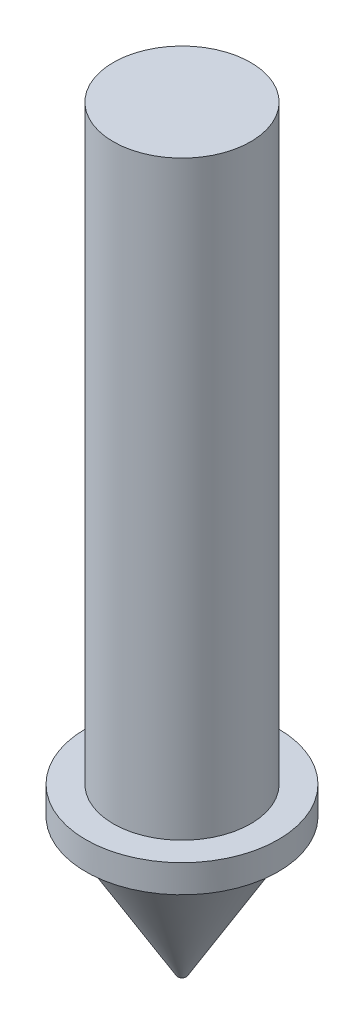
ISO-10303-21;
HEADER;
FILE_DESCRIPTION(('STEP AP214'),'2;1');
FILE_NAME('part.step','',(''),(''),'','','');
FILE_SCHEMA(('AUTOMOTIVE_DESIGN { 1 0 10303 214 1 1 1 1 }'));
ENDSEC;
DATA;
#1=APPLICATION_CONTEXT('core data for automotive mechanical design processes');
#2=APPLICATION_PROTOCOL_DEFINITION('international standard','automotive_design',2000,#1);
#3=PRODUCT_CONTEXT('',#1,'mechanical');
#4=PRODUCT('Part','Part','',(#3));
#5=PRODUCT_RELATED_PRODUCT_CATEGORY('part','',(#4));
#6=PRODUCT_DEFINITION_FORMATION('','',#4);
#7=PRODUCT_DEFINITION_CONTEXT('part definition',#1,'design');
#8=PRODUCT_DEFINITION('design','',#6,#7);
#9=PRODUCT_DEFINITION_SHAPE('','',#8);
#10=(LENGTH_UNIT() NAMED_UNIT(*) SI_UNIT(.MILLI.,.METRE.));
#11=(NAMED_UNIT(*) PLANE_ANGLE_UNIT() SI_UNIT($,.RADIAN.));
#12=(NAMED_UNIT(*) SI_UNIT($,.STERADIAN.) SOLID_ANGLE_UNIT());
#13=UNCERTAINTY_MEASURE_WITH_UNIT(LENGTH_MEASURE(1.E-05),#10,'distance_accuracy_value','');
#14=(GEOMETRIC_REPRESENTATION_CONTEXT(3) GLOBAL_UNCERTAINTY_ASSIGNED_CONTEXT((#13)) GLOBAL_UNIT_ASSIGNED_CONTEXT((#10,
#11,#12)) REPRESENTATION_CONTEXT('',''));
#15=CARTESIAN_POINT('',(0.,0.,0.));
#16=DIRECTION('',(0.,0.,1.));
#17=DIRECTION('',(1.,0.,0.));
#18=AXIS2_PLACEMENT_3D('',#15,#16,#17);
#19=CARTESIAN_POINT('',(0.,55.,0.));
#20=DIRECTION('',(0.,-1.,0.));
#21=DIRECTION('',(0.,0.,-1.));
#22=AXIS2_PLACEMENT_3D('',#19,#20,#21);
#23=CYLINDRICAL_SURFACE('',#22,7.);
#24=CARTESIAN_POINT('',(0.,12.,0.));
#25=DIRECTION('',(0.,1.,0.));
#26=DIRECTION('',(0.,0.,1.));
#27=AXIS2_PLACEMENT_3D('',#24,#25,#26);
#28=CIRCLE('',#27,7.);
#29=CARTESIAN_POINT('',(0.,12.,7.));
#30=VERTEX_POINT('',#29);
#31=EDGE_CURVE('E10',#30,#30,#28,.T.);
#32=ORIENTED_EDGE('',*,*,#31,.F.);
#33=EDGE_LOOP('',(#32));
#34=FACE_BOUND('',#33,.T.);
#35=CARTESIAN_POINT('',(0.,9.9745348310023,0.));
#36=DIRECTION('',(0.,-1.,0.));
#37=DIRECTION('',(0.,0.,-1.));
#38=AXIS2_PLACEMENT_3D('',#35,#36,#37);
#39=CIRCLE('',#38,7.);
#40=CARTESIAN_POINT('',(0.,9.9745348310023,-7.));
#41=VERTEX_POINT('',#40);
#42=EDGE_CURVE('E49',#41,#41,#39,.T.);
#43=ORIENTED_EDGE('',*,*,#42,.F.);
#44=EDGE_LOOP('',(#43));
#45=FACE_BOUND('',#44,.T.);
#46=ADVANCED_FACE('F33',(#34,#45),#23,.T.);
#47=CARTESIAN_POINT('',(0.,12.,0.));
#48=DIRECTION('',(0.,1.,0.));
#49=DIRECTION('',(0.,0.,1.));
#50=AXIS2_PLACEMENT_3D('',#47,#48,#49);
#51=CYLINDRICAL_SURFACE('',#50,5.);
#52=CARTESIAN_POINT('',(0.,12.,0.));
#53=DIRECTION('',(0.,1.,0.));
#54=DIRECTION('',(0.,0.,1.));
#55=AXIS2_PLACEMENT_3D('',#52,#53,#54);
#56=CIRCLE('',#55,5.);
#57=CARTESIAN_POINT('',(0.,12.,5.));
#58=VERTEX_POINT('',#57);
#59=EDGE_CURVE('E40',#58,#58,#56,.T.);
#60=ORIENTED_EDGE('',*,*,#59,.T.);
#61=EDGE_LOOP('',(#60));
#62=FACE_BOUND('',#61,.T.);
#63=CARTESIAN_POINT('',(0.,55.,0.));
#64=DIRECTION('',(0.,1.,0.));
#65=DIRECTION('',(0.,0.,1.));
#66=AXIS2_PLACEMENT_3D('',#63,#64,#65);
#67=CIRCLE('',#66,5.);
#68=CARTESIAN_POINT('',(0.,55.,5.));
#69=VERTEX_POINT('',#68);
#70=EDGE_CURVE('E36',#69,#69,#67,.T.);
#71=ORIENTED_EDGE('',*,*,#70,.F.);
#72=EDGE_LOOP('',(#71));
#73=FACE_BOUND('',#72,.T.);
#74=ADVANCED_FACE('F72',(#62,#73),#51,.T.);
#75=CARTESIAN_POINT('',(0.,12.,0.));
#76=DIRECTION('',(0.,1.,0.));
#77=DIRECTION('',(0.,0.,1.));
#78=AXIS2_PLACEMENT_3D('',#75,#76,#77);
#79=PLANE('',#78);
#80=ORIENTED_EDGE('',*,*,#59,.F.);
#81=EDGE_LOOP('',(#80));
#82=FACE_BOUND('',#81,.T.);
#83=ORIENTED_EDGE('',*,*,#31,.T.);
#84=EDGE_LOOP('',(#83));
#85=FACE_BOUND('',#84,.T.);
#86=ADVANCED_FACE('F77',(#82,#85),#79,.T.);
#87=CARTESIAN_POINT('',(0.,55.,0.));
#88=DIRECTION('',(0.,1.,0.));
#89=DIRECTION('',(0.,0.,1.));
#90=AXIS2_PLACEMENT_3D('',#87,#88,#89);
#91=PLANE('',#90);
#92=ORIENTED_EDGE('',*,*,#70,.T.);
#93=EDGE_LOOP('',(#92));
#94=FACE_BOUND('',#93,.T.);
#95=ADVANCED_FACE('F69',(#94),#91,.T.);
#96=CARTESIAN_POINT('',(0.,0.,0.));
#97=DIRECTION('',(0.,1.,0.));
#98=DIRECTION('',(0.,0.,1.));
#99=AXIS2_PLACEMENT_3D('',#96,#97,#98);
#100=CONICAL_SURFACE('',#99,0.30790693117666,0.535933509992402);
#101=CARTESIAN_POINT('',(0.,9.9745348310023,0.));
#102=DIRECTION('',(0.,-1.,0.));
#103=DIRECTION('',(0.,0.,-1.));
#104=AXIS2_PLACEMENT_3D('',#101,#102,#103);
#105=CIRCLE('',#104,6.23193667248145);
#106=CARTESIAN_POINT('',(0.,9.9745348310023,6.23193667248145));
#107=VERTEX_POINT('',#106);
#108=EDGE_CURVE('E52',#107,#107,#105,.T.);
#109=CARTESIAN_POINT('',(0.,0.,0.));
#110=DIRECTION('',(0.,-1.,0.));
#111=DIRECTION('',(0.,0.,-1.));
#112=AXIS2_PLACEMENT_3D('',#109,#110,#111);
#113=CIRCLE('',#112,0.30790693117666);
#114=CARTESIAN_POINT('',(0.,0.,0.30790693117666));
#115=VERTEX_POINT('',#114);
#116=EDGE_CURVE('E46',#115,#115,#113,.T.);
#117=CARTESIAN_POINT('',(0.,9.9745348310023,6.23193667248145));
#118=CARTESIAN_POINT('',(0.,9.8706334265127,6.17022802934286));
#119=CARTESIAN_POINT('',(0.,9.76673202202309,6.10851938620427));
#120=CARTESIAN_POINT('',(0.,9.55892921304387,5.98510209992709));
#121=CARTESIAN_POINT('',(0.,9.45502780855426,5.92339345678849));
#122=CARTESIAN_POINT('',(0.,9.24722499957505,5.79997617051131));
#123=CARTESIAN_POINT('',(0.,9.14332359508544,5.73826752737272));
#124=CARTESIAN_POINT('',(0.,8.93552078610623,5.61485024109554));
#125=CARTESIAN_POINT('',(0.,8.83161938161662,5.55314159795695));
#126=CARTESIAN_POINT('',(0.,8.62381657263741,5.42972431167976));
#127=CARTESIAN_POINT('',(0.,8.5199151681478,5.36801566854117));
#128=CARTESIAN_POINT('',(0.,8.31211235916859,5.24459838226399));
#129=CARTESIAN_POINT('',(0.,8.20821095467898,5.1828897391254));
#130=CARTESIAN_POINT('',(0.,8.00040814569976,5.05947245284821));
#131=CARTESIAN_POINT('',(0.,7.89650674121016,4.99776380970962));
#132=CARTESIAN_POINT('',(0.,7.68870393223094,4.87434652343244));
#133=CARTESIAN_POINT('',(0.,7.58480252774133,4.81263788029385));
#134=CARTESIAN_POINT('',(0.,7.37699971876212,4.68922059401666));
#135=CARTESIAN_POINT('',(0.,7.27309831427251,4.62751195087807));
#136=CARTESIAN_POINT('',(0.,7.0652955052933,4.50409466460089));
#137=CARTESIAN_POINT('',(0.,6.96139410080369,4.4423860214623));
#138=CARTESIAN_POINT('',(0.,6.75359129182447,4.31896873518511));
#139=CARTESIAN_POINT('',(0.,6.64968988733487,4.25726009204652));
#140=CARTESIAN_POINT('',(0.,6.44188707835565,4.13384280576934));
#141=CARTESIAN_POINT('',(0.,6.33798567386605,4.07213416263075));
#142=CARTESIAN_POINT('',(0.,6.13018286488683,3.94871687635356));
#143=CARTESIAN_POINT('',(0.,6.02628146039722,3.88700823321497));
#144=CARTESIAN_POINT('',(0.,5.81847865141801,3.76359094693779));
#145=CARTESIAN_POINT('',(0.,5.7145772469284,3.7018823037992));
#146=CARTESIAN_POINT('',(0.,5.50677443794919,3.57846501752201));
#147=CARTESIAN_POINT('',(0.,5.40287303345958,3.51675637438342));
#148=CARTESIAN_POINT('',(0.,5.19507022448037,3.39333908810624));
#149=CARTESIAN_POINT('',(0.,5.09116881999076,3.33163044496765));
#150=CARTESIAN_POINT('',(0.,4.88336601101154,3.20821315869046));
#151=CARTESIAN_POINT('',(0.,4.77946460652194,3.14650451555187));
#152=CARTESIAN_POINT('',(0.,4.57166179754272,3.02308722927469));
#153=CARTESIAN_POINT('',(0.,4.46776039305311,2.9613785861361));
#154=CARTESIAN_POINT('',(0.,4.2599575840739,2.83796129985892));
#155=CARTESIAN_POINT('',(0.,4.15605617958429,2.77625265672032));
#156=CARTESIAN_POINT('',(0.,3.94825337060508,2.65283537044314));
#157=CARTESIAN_POINT('',(0.,3.84435196611547,2.59112672730455));
#158=CARTESIAN_POINT('',(0.,3.63654915713626,2.46770944102737));
#159=CARTESIAN_POINT('',(0.,3.53264775264665,2.40600079788877));
#160=CARTESIAN_POINT('',(0.,3.32484494366743,2.28258351161159));
#161=CARTESIAN_POINT('',(0.,3.22094353917783,2.220874868473));
#162=CARTESIAN_POINT('',(0.,3.01314073019861,2.09745758219582));
#163=CARTESIAN_POINT('',(0.,2.909239325709,2.03574893905722));
#164=CARTESIAN_POINT('',(0.,2.70143651672979,1.91233165278004));
#165=CARTESIAN_POINT('',(0.,2.59753511224018,1.85062300964145));
#166=CARTESIAN_POINT('',(0.,2.38973230326097,1.72720572336427));
#167=CARTESIAN_POINT('',(0.,2.28583089877136,1.66549708022568));
#168=CARTESIAN_POINT('',(0.,2.07802808979215,1.54207979394849));
#169=CARTESIAN_POINT('',(0.,1.97412668530254,1.4803711508099));
#170=CARTESIAN_POINT('',(0.,1.76632387632332,1.35695386453272));
#171=CARTESIAN_POINT('',(0.,1.66242247183372,1.29524522139413));
#172=CARTESIAN_POINT('',(0.,1.4546196628545,1.17182793511694));
#173=CARTESIAN_POINT('',(0.,1.3507182583649,1.11011929197835));
#174=CARTESIAN_POINT('',(0.,1.14291544938568,0.986702005701168));
#175=CARTESIAN_POINT('',(0.,1.03901404489607,0.924993362562576));
#176=CARTESIAN_POINT('',(0.,0.831211235916859,0.801576076285393));
#177=CARTESIAN_POINT('',(0.,0.727309831427251,0.739867433146801));
#178=CARTESIAN_POINT('',(0.,0.519507022448037,0.616450146869618));
#179=CARTESIAN_POINT('',(0.,0.415605617958429,0.554741503731027));
#180=CARTESIAN_POINT('',(0.,0.207802808979215,0.431324217453843));
#181=CARTESIAN_POINT('',(0.,0.103901404489607,0.369615574315252));
#182=CARTESIAN_POINT('',(0.,0.,0.30790693117666));
#183=B_SPLINE_CURVE_WITH_KNOTS('',3,(#117,#118,#119,#120,#121,#122,#123,#124,#125,#126,#127,
#128,#129,#130,#131,#132,#133,#134,#135,#136,#137,#138,#139,#140,#141,#142,#143,#144,#145,#146,
#147,#148,#149,#150,#151,#152,#153,#154,#155,#156,#157,#158,#159,#160,#161,#162,#163,#164,#165,
#166,#167,#168,#169,#170,#171,#172,#173,#174,#175,#176,#177,#178,#179,#180,#181,#182),
.UNSPECIFIED.,.F.,.F.,(4,2,2,2,2,2,2,2,2,2,2,2,2,2,2,2,2,2,2,2,2,2,2,2,2,2,2,2,2,2,2,2,4),(0.,
0.362534310702134,0.725068621404268,1.0876029321064,1.45013724280854,1.81267155351067,
2.1752058642128,2.53774017491494,2.90027448561707,3.26280879631921,3.62534310702134,
3.98787741772347,4.35041172842561,4.71294603912774,5.07548034982987,5.43801466053201,
5.80054897123414,6.16308328193627,6.52561759263841,6.88815190334054,7.25068621404268,
7.61322052474481,7.97575483544694,8.33828914614908,8.70082345685121,9.06335776755334,
9.42589207825548,9.78842638895761,10.1509606996597,10.5134950103619,10.876029321064,
11.2385636317661,11.6010979424683),.UNSPECIFIED.);
#184=EDGE_CURVE('BSEAM56',#107,#115,#183,.T.);
#185=ORIENTED_EDGE('',*,*,#108,.T.);
#186=ORIENTED_EDGE('',*,*,#116,.F.);
#187=ORIENTED_EDGE('',*,*,#184,.T.);
#188=ORIENTED_EDGE('',*,*,#184,.F.);
#189=EDGE_LOOP('',(#185,#187,#186,#188));
#190=FACE_BOUND('',#189,.T.);
#191=ADVANCED_FACE('F56',(#190),#100,.T.);
#192=CARTESIAN_POINT('',(-7.,9.9745348310023,0.));
#193=DIRECTION('',(0.,-1.,0.));
#194=DIRECTION('',(0.,0.,-1.));
#195=AXIS2_PLACEMENT_3D('',#192,#193,#194);
#196=PLANE('',#195);
#197=ORIENTED_EDGE('',*,*,#42,.T.);
#198=EDGE_LOOP('',(#197));
#199=FACE_BOUND('',#198,.T.);
#200=ORIENTED_EDGE('',*,*,#108,.F.);
#201=EDGE_LOOP('',(#200));
#202=FACE_BOUND('',#201,.T.);
#203=ADVANCED_FACE('F59',(#199,#202),#196,.T.);
#204=CARTESIAN_POINT('',(0.,0.,0.));
#205=DIRECTION('',(0.,1.,0.));
#206=DIRECTION('',(0.,0.,1.));
#207=AXIS2_PLACEMENT_3D('',#204,#205,#206);
#208=PLANE('',#207);
#209=ORIENTED_EDGE('',*,*,#116,.T.);
#210=EDGE_LOOP('',(#209));
#211=FACE_BOUND('',#210,.T.);
#212=ADVANCED_FACE('F61',(#211),#208,.F.);
#213=CLOSED_SHELL('',(#46,#74,#86,#95,#191,#203,#212));
#214=MANIFOLD_SOLID_BREP('B2',#213);
#215=ADVANCED_BREP_SHAPE_REPRESENTATION('',(#18,#214),#14);
#216=SHAPE_DEFINITION_REPRESENTATION(#9,#215);
ENDSEC;
END-ISO-10303-21;
